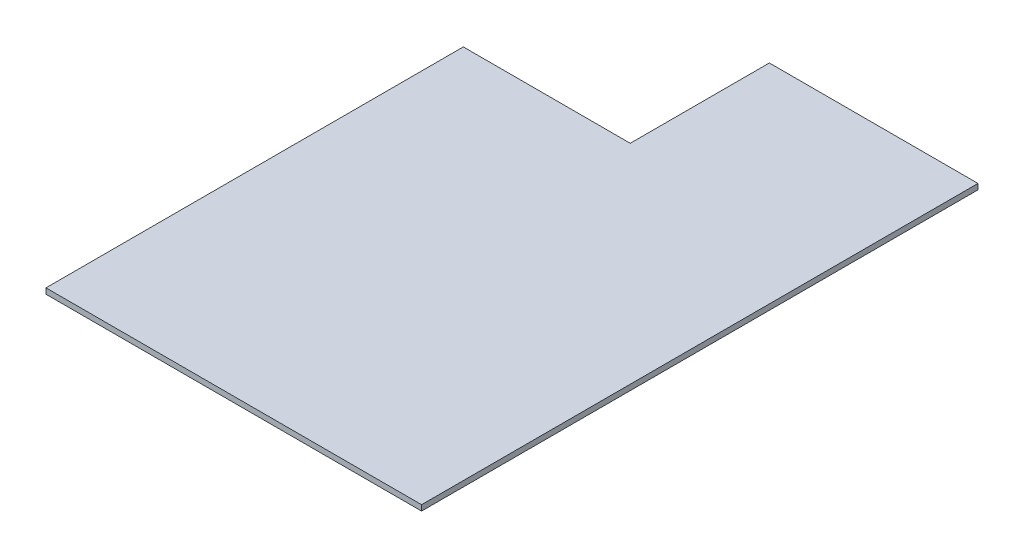
ISO-10303-21;
HEADER;
FILE_DESCRIPTION(('STEP AP214'),'2;1');
FILE_NAME('part.step','',(''),(''),'','','');
FILE_SCHEMA(('AUTOMOTIVE_DESIGN { 1 0 10303 214 1 1 1 1 }'));
ENDSEC;
DATA;
#1=APPLICATION_CONTEXT('core data for automotive mechanical design processes');
#2=APPLICATION_PROTOCOL_DEFINITION('international standard','automotive_design',2000,#1);
#3=PRODUCT_CONTEXT('',#1,'mechanical');
#4=PRODUCT('Part','Part','',(#3));
#5=PRODUCT_RELATED_PRODUCT_CATEGORY('part','',(#4));
#6=PRODUCT_DEFINITION_FORMATION('','',#4);
#7=PRODUCT_DEFINITION_CONTEXT('part definition',#1,'design');
#8=PRODUCT_DEFINITION('design','',#6,#7);
#9=PRODUCT_DEFINITION_SHAPE('','',#8);
#10=(LENGTH_UNIT() NAMED_UNIT(*) SI_UNIT(.MILLI.,.METRE.));
#11=(NAMED_UNIT(*) PLANE_ANGLE_UNIT() SI_UNIT($,.RADIAN.));
#12=(NAMED_UNIT(*) SI_UNIT($,.STERADIAN.) SOLID_ANGLE_UNIT());
#13=UNCERTAINTY_MEASURE_WITH_UNIT(LENGTH_MEASURE(1.E-05),#10,'distance_accuracy_value','');
#14=(GEOMETRIC_REPRESENTATION_CONTEXT(3) GLOBAL_UNCERTAINTY_ASSIGNED_CONTEXT((#13)) GLOBAL_UNIT_ASSIGNED_CONTEXT((#10,
#11,#12)) REPRESENTATION_CONTEXT('',''));
#15=CARTESIAN_POINT('',(0.,0.,0.));
#16=DIRECTION('',(0.,0.,1.));
#17=DIRECTION('',(1.,0.,0.));
#18=AXIS2_PLACEMENT_3D('',#15,#16,#17);
#19=CARTESIAN_POINT('',(0.,0.508,-38.1));
#20=DIRECTION('',(1.,0.,0.));
#21=DIRECTION('',(0.,0.,-1.));
#22=AXIS2_PLACEMENT_3D('',#19,#20,#21);
#23=PLANE('',#22);
#24=DIRECTION('',(0.,0.,1.));
#25=VECTOR('',#24,1.);
#26=CARTESIAN_POINT('',(0.,0.,-38.1));
#27=LINE('',#26,#25);
#28=CARTESIAN_POINT('',(0.,0.,-38.1));
#29=VERTEX_POINT('',#28);
#30=CARTESIAN_POINT('',(0.,0.,0.));
#31=VERTEX_POINT('',#30);
#32=EDGE_CURVE('E128',#29,#31,#27,.T.);
#33=ORIENTED_EDGE('',*,*,#32,.T.);
#34=DIRECTION('',(0.,-1.,0.));
#35=VECTOR('',#34,1.);
#36=CARTESIAN_POINT('',(0.,0.508,0.));
#37=LINE('',#36,#35);
#38=CARTESIAN_POINT('',(0.,0.508,0.));
#39=VERTEX_POINT('',#38);
#40=EDGE_CURVE('E11',#39,#31,#37,.T.);
#41=ORIENTED_EDGE('',*,*,#40,.F.);
#42=DIRECTION('',(0.,0.,1.));
#43=VECTOR('',#42,1.);
#44=CARTESIAN_POINT('',(0.,0.508,-38.1));
#45=LINE('',#44,#43);
#46=CARTESIAN_POINT('',(0.,0.508,-38.1));
#47=VERTEX_POINT('',#46);
#48=EDGE_CURVE('E144',#47,#39,#45,.T.);
#49=ORIENTED_EDGE('',*,*,#48,.F.);
#50=DIRECTION('',(0.,-1.,0.));
#51=VECTOR('',#50,1.);
#52=CARTESIAN_POINT('',(0.,0.508,-38.1));
#53=LINE('',#52,#51);
#54=EDGE_CURVE('E124',#47,#29,#53,.T.);
#55=ORIENTED_EDGE('',*,*,#54,.T.);
#56=EDGE_LOOP('',(#33,#41,#49,#55));
#57=FACE_BOUND('',#56,.T.);
#58=ADVANCED_FACE('F39',(#57),#23,.F.);
#59=CARTESIAN_POINT('',(0.,0.508,0.));
#60=DIRECTION('',(0.,0.,-1.));
#61=DIRECTION('',(-1.,0.,0.));
#62=AXIS2_PLACEMENT_3D('',#59,#60,#61);
#63=PLANE('',#62);
#64=DIRECTION('',(1.,0.,0.));
#65=VECTOR('',#64,1.);
#66=CARTESIAN_POINT('',(0.,0.,0.));
#67=LINE('',#66,#65);
#68=CARTESIAN_POINT('',(34.29,0.,0.));
#69=VERTEX_POINT('',#68);
#70=EDGE_CURVE('E132',#31,#69,#67,.T.);
#71=ORIENTED_EDGE('',*,*,#70,.T.);
#72=DIRECTION('',(0.,-1.,0.));
#73=VECTOR('',#72,1.);
#74=CARTESIAN_POINT('',(34.29,0.508,0.));
#75=LINE('',#74,#73);
#76=CARTESIAN_POINT('',(34.29,0.508,0.));
#77=VERTEX_POINT('',#76);
#78=EDGE_CURVE('E48',#77,#69,#75,.T.);
#79=ORIENTED_EDGE('',*,*,#78,.F.);
#80=DIRECTION('',(1.,0.,0.));
#81=VECTOR('',#80,1.);
#82=CARTESIAN_POINT('',(0.,0.508,0.));
#83=LINE('',#82,#81);
#84=EDGE_CURVE('E93',#39,#77,#83,.T.);
#85=ORIENTED_EDGE('',*,*,#84,.F.);
#86=ORIENTED_EDGE('',*,*,#40,.T.);
#87=EDGE_LOOP('',(#71,#79,#85,#86));
#88=FACE_BOUND('',#87,.T.);
#89=ADVANCED_FACE('F172',(#88),#63,.F.);
#90=CARTESIAN_POINT('',(34.29,0.508,0.));
#91=DIRECTION('',(-1.,0.,0.));
#92=DIRECTION('',(0.,0.,1.));
#93=AXIS2_PLACEMENT_3D('',#90,#91,#92);
#94=PLANE('',#93);
#95=DIRECTION('',(0.,0.,-1.));
#96=VECTOR('',#95,1.);
#97=CARTESIAN_POINT('',(34.29,0.,0.));
#98=LINE('',#97,#96);
#99=CARTESIAN_POINT('',(34.29,0.,-50.8));
#100=VERTEX_POINT('',#99);
#101=EDGE_CURVE('E135',#69,#100,#98,.T.);
#102=ORIENTED_EDGE('',*,*,#101,.T.);
#103=DIRECTION('',(0.,-1.,0.));
#104=VECTOR('',#103,1.);
#105=CARTESIAN_POINT('',(34.29,0.508,-50.8));
#106=LINE('',#105,#104);
#107=CARTESIAN_POINT('',(34.29,0.508,-50.8));
#108=VERTEX_POINT('',#107);
#109=EDGE_CURVE('E117',#108,#100,#106,.T.);
#110=ORIENTED_EDGE('',*,*,#109,.F.);
#111=DIRECTION('',(0.,0.,-1.));
#112=VECTOR('',#111,1.);
#113=CARTESIAN_POINT('',(34.29,0.508,0.));
#114=LINE('',#113,#112);
#115=EDGE_CURVE('E106',#77,#108,#114,.T.);
#116=ORIENTED_EDGE('',*,*,#115,.F.);
#117=ORIENTED_EDGE('',*,*,#78,.T.);
#118=EDGE_LOOP('',(#102,#110,#116,#117));
#119=FACE_BOUND('',#118,.T.);
#120=ADVANCED_FACE('F154',(#119),#94,.F.);
#121=CARTESIAN_POINT('',(34.29,0.508,-50.8));
#122=DIRECTION('',(0.,0.,1.));
#123=DIRECTION('',(1.,0.,0.));
#124=AXIS2_PLACEMENT_3D('',#121,#122,#123);
#125=PLANE('',#124);
#126=DIRECTION('',(-1.,0.,0.));
#127=VECTOR('',#126,1.);
#128=CARTESIAN_POINT('',(34.29,0.,-50.8));
#129=LINE('',#128,#127);
#130=CARTESIAN_POINT('',(15.24,0.,-50.8));
#131=VERTEX_POINT('',#130);
#132=EDGE_CURVE('E115',#100,#131,#129,.T.);
#133=ORIENTED_EDGE('',*,*,#132,.T.);
#134=DIRECTION('',(0.,-1.,0.));
#135=VECTOR('',#134,1.);
#136=CARTESIAN_POINT('',(15.24,0.508,-50.8));
#137=LINE('',#136,#135);
#138=CARTESIAN_POINT('',(15.24,0.508,-50.8));
#139=VERTEX_POINT('',#138);
#140=EDGE_CURVE('E112',#139,#131,#137,.T.);
#141=ORIENTED_EDGE('',*,*,#140,.F.);
#142=DIRECTION('',(-1.,0.,0.));
#143=VECTOR('',#142,1.);
#144=CARTESIAN_POINT('',(34.29,0.508,-50.8));
#145=LINE('',#144,#143);
#146=EDGE_CURVE('E100',#108,#139,#145,.T.);
#147=ORIENTED_EDGE('',*,*,#146,.F.);
#148=ORIENTED_EDGE('',*,*,#109,.T.);
#149=EDGE_LOOP('',(#133,#141,#147,#148));
#150=FACE_BOUND('',#149,.T.);
#151=ADVANCED_FACE('F113',(#150),#125,.F.);
#152=CARTESIAN_POINT('',(15.24,0.508,-50.8));
#153=DIRECTION('',(1.,0.,0.));
#154=DIRECTION('',(0.,0.,-1.));
#155=AXIS2_PLACEMENT_3D('',#152,#153,#154);
#156=PLANE('',#155);
#157=DIRECTION('',(0.,0.,1.));
#158=VECTOR('',#157,1.);
#159=CARTESIAN_POINT('',(15.24,0.,-50.8));
#160=LINE('',#159,#158);
#161=CARTESIAN_POINT('',(15.24,0.,-38.1));
#162=VERTEX_POINT('',#161);
#163=EDGE_CURVE('E79',#131,#162,#160,.T.);
#164=ORIENTED_EDGE('',*,*,#163,.T.);
#165=DIRECTION('',(0.,-1.,0.));
#166=VECTOR('',#165,1.);
#167=CARTESIAN_POINT('',(15.24,0.508,-38.1));
#168=LINE('',#167,#166);
#169=CARTESIAN_POINT('',(15.24,0.508,-38.1));
#170=VERTEX_POINT('',#169);
#171=EDGE_CURVE('E118',#170,#162,#168,.T.);
#172=ORIENTED_EDGE('',*,*,#171,.F.);
#173=DIRECTION('',(0.,0.,1.));
#174=VECTOR('',#173,1.);
#175=CARTESIAN_POINT('',(15.24,0.508,-50.8));
#176=LINE('',#175,#174);
#177=EDGE_CURVE('E104',#139,#170,#176,.T.);
#178=ORIENTED_EDGE('',*,*,#177,.F.);
#179=ORIENTED_EDGE('',*,*,#140,.T.);
#180=EDGE_LOOP('',(#164,#172,#178,#179));
#181=FACE_BOUND('',#180,.T.);
#182=ADVANCED_FACE('F120',(#181),#156,.F.);
#183=CARTESIAN_POINT('',(15.24,0.508,-38.1));
#184=DIRECTION('',(0.,0.,1.));
#185=DIRECTION('',(1.,0.,0.));
#186=AXIS2_PLACEMENT_3D('',#183,#184,#185);
#187=PLANE('',#186);
#188=DIRECTION('',(-1.,0.,0.));
#189=VECTOR('',#188,1.);
#190=CARTESIAN_POINT('',(15.24,0.,-38.1));
#191=LINE('',#190,#189);
#192=EDGE_CURVE('E85',#162,#29,#191,.T.);
#193=ORIENTED_EDGE('',*,*,#192,.T.);
#194=ORIENTED_EDGE('',*,*,#54,.F.);
#195=DIRECTION('',(-1.,0.,0.));
#196=VECTOR('',#195,1.);
#197=CARTESIAN_POINT('',(15.24,0.508,-38.1));
#198=LINE('',#197,#196);
#199=EDGE_CURVE('E56',#170,#47,#198,.T.);
#200=ORIENTED_EDGE('',*,*,#199,.F.);
#201=ORIENTED_EDGE('',*,*,#171,.T.);
#202=EDGE_LOOP('',(#193,#194,#200,#201));
#203=FACE_BOUND('',#202,.T.);
#204=ADVANCED_FACE('F161',(#203),#187,.F.);
#205=CARTESIAN_POINT('',(0.,0.508,0.));
#206=DIRECTION('',(0.,1.,0.));
#207=DIRECTION('',(0.,0.,1.));
#208=AXIS2_PLACEMENT_3D('',#205,#206,#207);
#209=PLANE('',#208);
#210=ORIENTED_EDGE('',*,*,#48,.T.);
#211=ORIENTED_EDGE('',*,*,#84,.T.);
#212=ORIENTED_EDGE('',*,*,#115,.T.);
#213=ORIENTED_EDGE('',*,*,#146,.T.);
#214=ORIENTED_EDGE('',*,*,#177,.T.);
#215=ORIENTED_EDGE('',*,*,#199,.T.);
#216=EDGE_LOOP('',(#210,#211,#212,#213,#214,#215));
#217=FACE_BOUND('',#216,.T.);
#218=ADVANCED_FACE('F102',(#217),#209,.T.);
#219=CARTESIAN_POINT('',(0.,0.,0.));
#220=DIRECTION('',(0.,1.,0.));
#221=DIRECTION('',(0.,0.,1.));
#222=AXIS2_PLACEMENT_3D('',#219,#220,#221);
#223=PLANE('',#222);
#224=ORIENTED_EDGE('',*,*,#32,.F.);
#225=ORIENTED_EDGE('',*,*,#192,.F.);
#226=ORIENTED_EDGE('',*,*,#163,.F.);
#227=ORIENTED_EDGE('',*,*,#132,.F.);
#228=ORIENTED_EDGE('',*,*,#101,.F.);
#229=ORIENTED_EDGE('',*,*,#70,.F.);
#230=EDGE_LOOP('',(#224,#225,#226,#227,#228,#229));
#231=FACE_BOUND('',#230,.T.);
#232=ADVANCED_FACE('F157',(#231),#223,.F.);
#233=CLOSED_SHELL('',(#58,#89,#120,#151,#182,#204,#218,#232));
#234=MANIFOLD_SOLID_BREP('B2',#233);
#235=ADVANCED_BREP_SHAPE_REPRESENTATION('',(#18,#234),#14);
#236=SHAPE_DEFINITION_REPRESENTATION(#9,#235);
ENDSEC;
END-ISO-10303-21;
